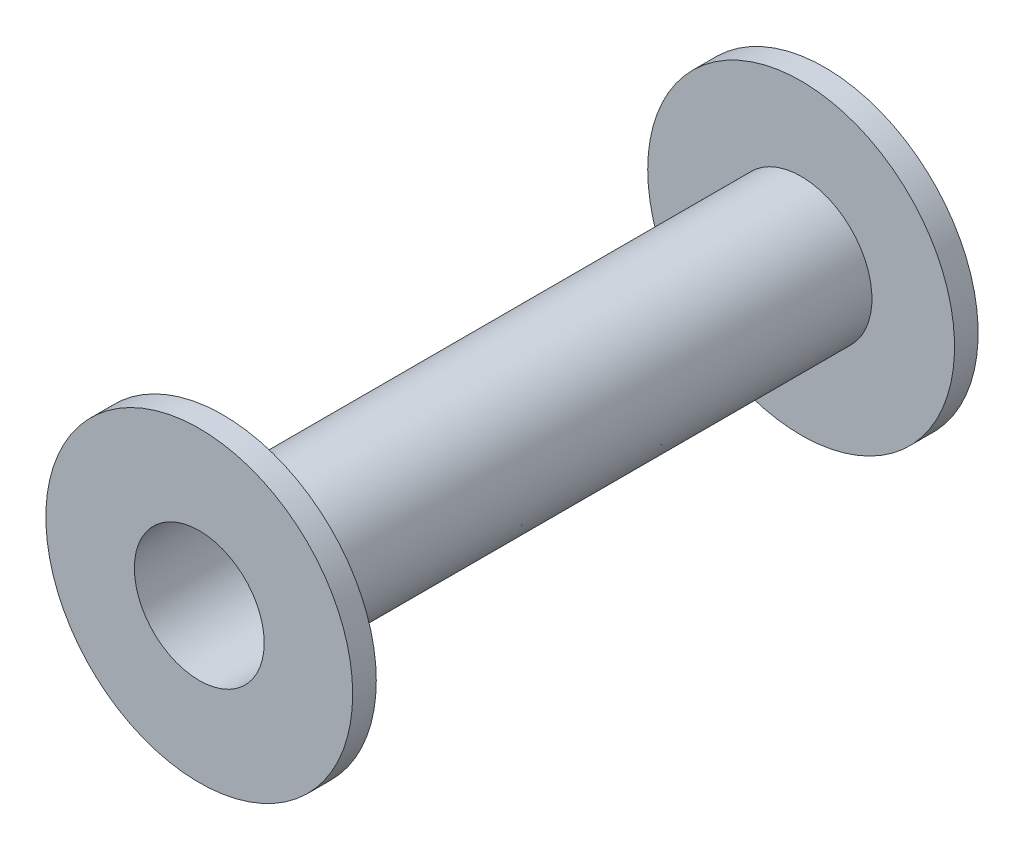
ISO-10303-21;
HEADER;
FILE_DESCRIPTION(('STEP AP214'),'2;1');
FILE_NAME('part.step','',(''),(''),'','','');
FILE_SCHEMA(('AUTOMOTIVE_DESIGN { 1 0 10303 214 1 1 1 1 }'));
ENDSEC;
DATA;
#1=APPLICATION_CONTEXT('core data for automotive mechanical design processes');
#2=APPLICATION_PROTOCOL_DEFINITION('international standard','automotive_design',2000,#1);
#3=PRODUCT_CONTEXT('',#1,'mechanical');
#4=PRODUCT('Part','Part','',(#3));
#5=PRODUCT_RELATED_PRODUCT_CATEGORY('part','',(#4));
#6=PRODUCT_DEFINITION_FORMATION('','',#4);
#7=PRODUCT_DEFINITION_CONTEXT('part definition',#1,'design');
#8=PRODUCT_DEFINITION('design','',#6,#7);
#9=PRODUCT_DEFINITION_SHAPE('','',#8);
#10=(LENGTH_UNIT() NAMED_UNIT(*) SI_UNIT(.MILLI.,.METRE.));
#11=(NAMED_UNIT(*) PLANE_ANGLE_UNIT() SI_UNIT($,.RADIAN.));
#12=(NAMED_UNIT(*) SI_UNIT($,.STERADIAN.) SOLID_ANGLE_UNIT());
#13=UNCERTAINTY_MEASURE_WITH_UNIT(LENGTH_MEASURE(1.E-05),#10,'distance_accuracy_value','');
#14=(GEOMETRIC_REPRESENTATION_CONTEXT(3) GLOBAL_UNCERTAINTY_ASSIGNED_CONTEXT((#13)) GLOBAL_UNIT_ASSIGNED_CONTEXT((#10,
#11,#12)) REPRESENTATION_CONTEXT('',''));
#15=CARTESIAN_POINT('',(0.,0.,0.));
#16=DIRECTION('',(0.,0.,1.));
#17=DIRECTION('',(1.,0.,0.));
#18=AXIS2_PLACEMENT_3D('',#15,#16,#17);
#19=CARTESIAN_POINT('',(0.,0.,49.));
#20=DIRECTION('',(0.,0.,-1.));
#21=DIRECTION('',(-1.,0.,0.));
#22=AXIS2_PLACEMENT_3D('',#19,#20,#21);
#23=CYLINDRICAL_SURFACE('',#22,6.);
#24=CARTESIAN_POINT('',(0.,0.,49.));
#25=DIRECTION('',(0.,0.,1.));
#26=DIRECTION('',(1.,0.,0.));
#27=AXIS2_PLACEMENT_3D('',#24,#25,#26);
#28=CIRCLE('',#27,6.);
#29=CARTESIAN_POINT('',(6.,0.,49.));
#30=VERTEX_POINT('',#29);
#31=EDGE_CURVE('E10',#30,#30,#28,.T.);
#32=ORIENTED_EDGE('',*,*,#31,.F.);
#33=EDGE_LOOP('',(#32));
#34=FACE_BOUND('',#33,.T.);
#35=CARTESIAN_POINT('',(0.,0.,0.));
#36=DIRECTION('',(0.,0.,-1.));
#37=DIRECTION('',(-1.,0.,0.));
#38=AXIS2_PLACEMENT_3D('',#35,#36,#37);
#39=CIRCLE('',#38,6.);
#40=CARTESIAN_POINT('',(-6.,0.,0.));
#41=VERTEX_POINT('',#40);
#42=EDGE_CURVE('E49',#41,#41,#39,.T.);
#43=ORIENTED_EDGE('',*,*,#42,.F.);
#44=EDGE_LOOP('',(#43));
#45=FACE_BOUND('',#44,.T.);
#46=ADVANCED_FACE('F30',(#34,#45),#23,.T.);
#47=CARTESIAN_POINT('',(0.,0.,49.));
#48=DIRECTION('',(0.,0.,-1.));
#49=DIRECTION('',(-1.,0.,0.));
#50=AXIS2_PLACEMENT_3D('',#47,#48,#49);
#51=CYLINDRICAL_SURFACE('',#50,5.5);
#52=CARTESIAN_POINT('',(0.,0.,51.));
#53=DIRECTION('',(0.,0.,1.));
#54=DIRECTION('',(1.,0.,0.));
#55=AXIS2_PLACEMENT_3D('',#52,#53,#54);
#56=CIRCLE('',#55,5.5);
#57=CARTESIAN_POINT('',(5.5,0.,51.));
#58=VERTEX_POINT('',#57);
#59=EDGE_CURVE('E45',#58,#58,#56,.T.);
#60=ORIENTED_EDGE('',*,*,#59,.T.);
#61=EDGE_LOOP('',(#60));
#62=FACE_BOUND('',#61,.T.);
#63=CARTESIAN_POINT('',(0.,0.,-2.));
#64=DIRECTION('',(0.,0.,-1.));
#65=DIRECTION('',(-1.,0.,0.));
#66=AXIS2_PLACEMENT_3D('',#63,#64,#65);
#67=CIRCLE('',#66,5.5);
#68=CARTESIAN_POINT('',(-5.5,0.,-2.));
#69=VERTEX_POINT('',#68);
#70=EDGE_CURVE('E56',#69,#69,#67,.T.);
#71=ORIENTED_EDGE('',*,*,#70,.T.);
#72=EDGE_LOOP('',(#71));
#73=FACE_BOUND('',#72,.T.);
#74=ADVANCED_FACE('F62',(#62,#73),#51,.F.);
#75=CARTESIAN_POINT('',(0.,0.,49.));
#76=DIRECTION('',(0.,0.,1.));
#77=DIRECTION('',(1.,0.,0.));
#78=AXIS2_PLACEMENT_3D('',#75,#76,#77);
#79=PLANE('',#78);
#80=CARTESIAN_POINT('',(0.,0.,49.));
#81=DIRECTION('',(0.,0.,1.));
#82=DIRECTION('',(1.,0.,0.));
#83=AXIS2_PLACEMENT_3D('',#80,#81,#82);
#84=CIRCLE('',#83,13.);
#85=CARTESIAN_POINT('',(13.,0.,49.));
#86=VERTEX_POINT('',#85);
#87=EDGE_CURVE('E40',#86,#86,#84,.T.);
#88=ORIENTED_EDGE('',*,*,#87,.F.);
#89=EDGE_LOOP('',(#88));
#90=FACE_BOUND('',#89,.T.);
#91=ORIENTED_EDGE('',*,*,#31,.T.);
#92=EDGE_LOOP('',(#91));
#93=FACE_BOUND('',#92,.T.);
#94=ADVANCED_FACE('F84',(#90,#93),#79,.F.);
#95=CARTESIAN_POINT('',(0.,0.,51.));
#96=DIRECTION('',(0.,0.,1.));
#97=DIRECTION('',(1.,0.,0.));
#98=AXIS2_PLACEMENT_3D('',#95,#96,#97);
#99=PLANE('',#98);
#100=CARTESIAN_POINT('',(0.,0.,51.));
#101=DIRECTION('',(0.,0.,1.));
#102=DIRECTION('',(1.,0.,0.));
#103=AXIS2_PLACEMENT_3D('',#100,#101,#102);
#104=CIRCLE('',#103,13.);
#105=CARTESIAN_POINT('',(13.,0.,51.));
#106=VERTEX_POINT('',#105);
#107=EDGE_CURVE('E36',#106,#106,#104,.T.);
#108=ORIENTED_EDGE('',*,*,#107,.T.);
#109=EDGE_LOOP('',(#108));
#110=FACE_BOUND('',#109,.T.);
#111=ORIENTED_EDGE('',*,*,#59,.F.);
#112=EDGE_LOOP('',(#111));
#113=FACE_BOUND('',#112,.T.);
#114=ADVANCED_FACE('F92',(#110,#113),#99,.T.);
#115=CARTESIAN_POINT('',(0.,0.,51.));
#116=DIRECTION('',(0.,0.,-1.));
#117=DIRECTION('',(-1.,0.,0.));
#118=AXIS2_PLACEMENT_3D('',#115,#116,#117);
#119=CYLINDRICAL_SURFACE('',#118,13.);
#120=ORIENTED_EDGE('',*,*,#107,.F.);
#121=EDGE_LOOP('',(#120));
#122=FACE_BOUND('',#121,.T.);
#123=ORIENTED_EDGE('',*,*,#87,.T.);
#124=EDGE_LOOP('',(#123));
#125=FACE_BOUND('',#124,.T.);
#126=ADVANCED_FACE('F76',(#122,#125),#119,.T.);
#127=CARTESIAN_POINT('',(0.,0.,0.));
#128=DIRECTION('',(0.,0.,-1.));
#129=DIRECTION('',(-1.,0.,0.));
#130=AXIS2_PLACEMENT_3D('',#127,#128,#129);
#131=PLANE('',#130);
#132=CARTESIAN_POINT('',(0.,0.,0.));
#133=DIRECTION('',(0.,0.,-1.));
#134=DIRECTION('',(-1.,0.,0.));
#135=AXIS2_PLACEMENT_3D('',#132,#133,#134);
#136=CIRCLE('',#135,13.);
#137=CARTESIAN_POINT('',(-13.,0.,0.));
#138=VERTEX_POINT('',#137);
#139=EDGE_CURVE('E53',#138,#138,#136,.T.);
#140=ORIENTED_EDGE('',*,*,#139,.F.);
#141=EDGE_LOOP('',(#140));
#142=FACE_BOUND('',#141,.T.);
#143=ORIENTED_EDGE('',*,*,#42,.T.);
#144=EDGE_LOOP('',(#143));
#145=FACE_BOUND('',#144,.T.);
#146=ADVANCED_FACE('F67',(#142,#145),#131,.F.);
#147=CARTESIAN_POINT('',(0.,0.,-2.));
#148=DIRECTION('',(0.,0.,-1.));
#149=DIRECTION('',(-1.,0.,0.));
#150=AXIS2_PLACEMENT_3D('',#147,#148,#149);
#151=PLANE('',#150);
#152=CARTESIAN_POINT('',(0.,0.,-2.));
#153=DIRECTION('',(0.,0.,-1.));
#154=DIRECTION('',(-1.,0.,0.));
#155=AXIS2_PLACEMENT_3D('',#152,#153,#154);
#156=CIRCLE('',#155,13.);
#157=CARTESIAN_POINT('',(-13.,0.,-2.));
#158=VERTEX_POINT('',#157);
#159=EDGE_CURVE('E52',#158,#158,#156,.T.);
#160=ORIENTED_EDGE('',*,*,#159,.T.);
#161=EDGE_LOOP('',(#160));
#162=FACE_BOUND('',#161,.T.);
#163=ORIENTED_EDGE('',*,*,#70,.F.);
#164=EDGE_LOOP('',(#163));
#165=FACE_BOUND('',#164,.T.);
#166=ADVANCED_FACE('F64',(#162,#165),#151,.T.);
#167=CARTESIAN_POINT('',(0.,0.,-2.));
#168=DIRECTION('',(0.,0.,1.));
#169=DIRECTION('',(1.,0.,0.));
#170=AXIS2_PLACEMENT_3D('',#167,#168,#169);
#171=CYLINDRICAL_SURFACE('',#170,13.);
#172=ORIENTED_EDGE('',*,*,#159,.F.);
#173=EDGE_LOOP('',(#172));
#174=FACE_BOUND('',#173,.T.);
#175=ORIENTED_EDGE('',*,*,#139,.T.);
#176=EDGE_LOOP('',(#175));
#177=FACE_BOUND('',#176,.T.);
#178=ADVANCED_FACE('F66',(#174,#177),#171,.T.);
#179=CLOSED_SHELL('',(#46,#74,#94,#114,#126,#146,#166,#178));
#180=MANIFOLD_SOLID_BREP('B2',#179);
#181=ADVANCED_BREP_SHAPE_REPRESENTATION('',(#18,#180),#14);
#182=SHAPE_DEFINITION_REPRESENTATION(#9,#181);
ENDSEC;
END-ISO-10303-21;
